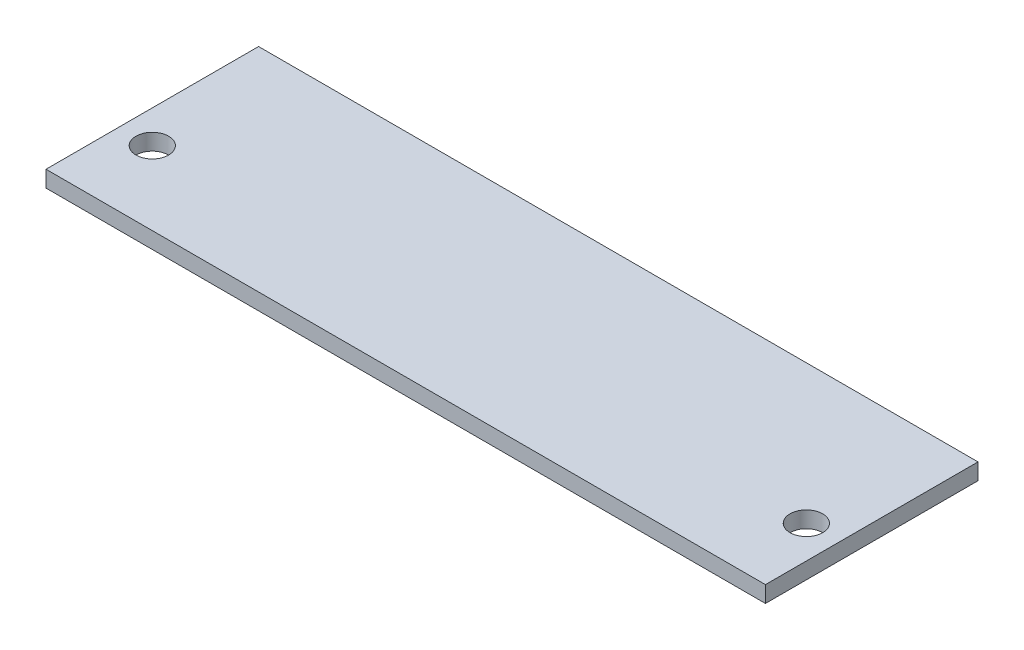
ISO-10303-21;
HEADER;
FILE_DESCRIPTION(('STEP AP214'),'2;1');
FILE_NAME('part.step','',(''),(''),'','','');
FILE_SCHEMA(('AUTOMOTIVE_DESIGN { 1 0 10303 214 1 1 1 1 }'));
ENDSEC;
DATA;
#1=APPLICATION_CONTEXT('core data for automotive mechanical design processes');
#2=APPLICATION_PROTOCOL_DEFINITION('international standard','automotive_design',2000,#1);
#3=PRODUCT_CONTEXT('',#1,'mechanical');
#4=PRODUCT('Part','Part','',(#3));
#5=PRODUCT_RELATED_PRODUCT_CATEGORY('part','',(#4));
#6=PRODUCT_DEFINITION_FORMATION('','',#4);
#7=PRODUCT_DEFINITION_CONTEXT('part definition',#1,'design');
#8=PRODUCT_DEFINITION('design','',#6,#7);
#9=PRODUCT_DEFINITION_SHAPE('','',#8);
#10=(LENGTH_UNIT() NAMED_UNIT(*) SI_UNIT(.MILLI.,.METRE.));
#11=(NAMED_UNIT(*) PLANE_ANGLE_UNIT() SI_UNIT($,.RADIAN.));
#12=(NAMED_UNIT(*) SI_UNIT($,.STERADIAN.) SOLID_ANGLE_UNIT());
#13=UNCERTAINTY_MEASURE_WITH_UNIT(LENGTH_MEASURE(1.E-05),#10,'distance_accuracy_value','');
#14=(GEOMETRIC_REPRESENTATION_CONTEXT(3) GLOBAL_UNCERTAINTY_ASSIGNED_CONTEXT((#13)) GLOBAL_UNIT_ASSIGNED_CONTEXT((#10,
#11,#12)) REPRESENTATION_CONTEXT('',''));
#15=CARTESIAN_POINT('',(0.,0.,0.));
#16=DIRECTION('',(0.,0.,1.));
#17=DIRECTION('',(1.,0.,0.));
#18=AXIS2_PLACEMENT_3D('',#15,#16,#17);
#19=CARTESIAN_POINT('',(0.,6.35,0.));
#20=DIRECTION('',(0.,1.,0.));
#21=DIRECTION('',(0.,0.,1.));
#22=AXIS2_PLACEMENT_3D('',#19,#20,#21);
#23=PLANE('',#22);
#24=CARTESIAN_POINT('',(12.7,6.35,53.97321438));
#25=DIRECTION('',(0.,1.,0.));
#26=DIRECTION('',(0.,0.,1.));
#27=AXIS2_PLACEMENT_3D('',#24,#25,#26);
#28=CIRCLE('',#27,6.35);
#29=CARTESIAN_POINT('',(12.7,6.35,60.32321438));
#30=VERTEX_POINT('',#29);
#31=EDGE_CURVE('E102',#30,#30,#28,.T.);
#32=ORIENTED_EDGE('',*,*,#31,.F.);
#33=EDGE_LOOP('',(#32));
#34=FACE_BOUND('',#33,.T.);
#35=DIRECTION('',(0.,0.,1.));
#36=VECTOR('',#35,1.);
#37=CARTESIAN_POINT('',(0.,6.35,0.));
#38=LINE('',#37,#36);
#39=CARTESIAN_POINT('',(0.,6.35,0.));
#40=VERTEX_POINT('',#39);
#41=CARTESIAN_POINT('',(0.,6.35,82.55));
#42=VERTEX_POINT('',#41);
#43=EDGE_CURVE('E87',#40,#42,#38,.T.);
#44=ORIENTED_EDGE('',*,*,#43,.T.);
#45=DIRECTION('',(1.,0.,0.));
#46=VECTOR('',#45,1.);
#47=CARTESIAN_POINT('',(0.,6.35,82.55));
#48=LINE('',#47,#46);
#49=CARTESIAN_POINT('',(279.4,6.35,82.55));
#50=VERTEX_POINT('',#49);
#51=EDGE_CURVE('E82',#42,#50,#48,.T.);
#52=ORIENTED_EDGE('',*,*,#51,.T.);
#53=DIRECTION('',(0.,0.,-1.));
#54=VECTOR('',#53,1.);
#55=CARTESIAN_POINT('',(279.4,6.35,0.));
#56=LINE('',#55,#54);
#57=CARTESIAN_POINT('',(279.4,6.35,0.));
#58=VERTEX_POINT('',#57);
#59=EDGE_CURVE('E85',#50,#58,#56,.T.);
#60=ORIENTED_EDGE('',*,*,#59,.T.);
#61=DIRECTION('',(-1.,0.,0.));
#62=VECTOR('',#61,1.);
#63=CARTESIAN_POINT('',(0.,6.35,0.));
#64=LINE('',#63,#62);
#65=EDGE_CURVE('E52',#58,#40,#64,.T.);
#66=ORIENTED_EDGE('',*,*,#65,.T.);
#67=EDGE_LOOP('',(#44,#52,#60,#66));
#68=FACE_BOUND('',#67,.T.);
#69=CARTESIAN_POINT('',(266.7,6.35,53.97321438));
#70=DIRECTION('',(0.,1.,0.));
#71=DIRECTION('',(0.,0.,1.));
#72=AXIS2_PLACEMENT_3D('',#69,#70,#71);
#73=CIRCLE('',#72,6.35);
#74=CARTESIAN_POINT('',(266.7,6.35,60.32321438));
#75=VERTEX_POINT('',#74);
#76=EDGE_CURVE('E117',#75,#75,#73,.T.);
#77=ORIENTED_EDGE('',*,*,#76,.F.);
#78=EDGE_LOOP('',(#77));
#79=FACE_BOUND('',#78,.T.);
#80=ADVANCED_FACE('F35',(#34,#68,#79),#23,.T.);
#81=CARTESIAN_POINT('',(0.,0.,0.));
#82=DIRECTION('',(0.,1.,0.));
#83=DIRECTION('',(0.,0.,1.));
#84=AXIS2_PLACEMENT_3D('',#81,#82,#83);
#85=PLANE('',#84);
#86=DIRECTION('',(0.,0.,1.));
#87=VECTOR('',#86,1.);
#88=CARTESIAN_POINT('',(0.,0.,0.));
#89=LINE('',#88,#87);
#90=CARTESIAN_POINT('',(0.,0.,0.));
#91=VERTEX_POINT('',#90);
#92=CARTESIAN_POINT('',(0.,0.,82.55));
#93=VERTEX_POINT('',#92);
#94=EDGE_CURVE('E99',#91,#93,#89,.T.);
#95=ORIENTED_EDGE('',*,*,#94,.F.);
#96=DIRECTION('',(-1.,0.,0.));
#97=VECTOR('',#96,1.);
#98=CARTESIAN_POINT('',(0.,0.,0.));
#99=LINE('',#98,#97);
#100=CARTESIAN_POINT('',(279.4,0.,0.));
#101=VERTEX_POINT('',#100);
#102=EDGE_CURVE('E75',#101,#91,#99,.T.);
#103=ORIENTED_EDGE('',*,*,#102,.F.);
#104=DIRECTION('',(0.,0.,-1.));
#105=VECTOR('',#104,1.);
#106=CARTESIAN_POINT('',(279.4,0.,0.));
#107=LINE('',#106,#105);
#108=CARTESIAN_POINT('',(279.4,0.,82.55));
#109=VERTEX_POINT('',#108);
#110=EDGE_CURVE('E69',#109,#101,#107,.T.);
#111=ORIENTED_EDGE('',*,*,#110,.F.);
#112=DIRECTION('',(1.,0.,0.));
#113=VECTOR('',#112,1.);
#114=CARTESIAN_POINT('',(0.,0.,82.55));
#115=LINE('',#114,#113);
#116=EDGE_CURVE('E91',#93,#109,#115,.T.);
#117=ORIENTED_EDGE('',*,*,#116,.F.);
#118=EDGE_LOOP('',(#95,#103,#111,#117));
#119=FACE_BOUND('',#118,.T.);
#120=CARTESIAN_POINT('',(12.7,0.,53.97321438));
#121=DIRECTION('',(0.,1.,0.));
#122=DIRECTION('',(0.,0.,1.));
#123=AXIS2_PLACEMENT_3D('',#120,#121,#122);
#124=CIRCLE('',#123,6.35);
#125=CARTESIAN_POINT('',(12.7,0.,60.32321438));
#126=VERTEX_POINT('',#125);
#127=EDGE_CURVE('E114',#126,#126,#124,.T.);
#128=ORIENTED_EDGE('',*,*,#127,.T.);
#129=EDGE_LOOP('',(#128));
#130=FACE_BOUND('',#129,.T.);
#131=CARTESIAN_POINT('',(266.7,0.,53.97321438));
#132=DIRECTION('',(0.,1.,0.));
#133=DIRECTION('',(0.,0.,1.));
#134=AXIS2_PLACEMENT_3D('',#131,#132,#133);
#135=CIRCLE('',#134,6.35);
#136=CARTESIAN_POINT('',(266.7,0.,60.32321438));
#137=VERTEX_POINT('',#136);
#138=EDGE_CURVE('E120',#137,#137,#135,.T.);
#139=ORIENTED_EDGE('',*,*,#138,.T.);
#140=EDGE_LOOP('',(#139));
#141=FACE_BOUND('',#140,.T.);
#142=ADVANCED_FACE('F110',(#119,#130,#141),#85,.F.);
#143=CARTESIAN_POINT('',(0.,6.35,0.));
#144=DIRECTION('',(1.,0.,0.));
#145=DIRECTION('',(0.,0.,-1.));
#146=AXIS2_PLACEMENT_3D('',#143,#144,#145);
#147=PLANE('',#146);
#148=ORIENTED_EDGE('',*,*,#94,.T.);
#149=DIRECTION('',(0.,-1.,0.));
#150=VECTOR('',#149,1.);
#151=CARTESIAN_POINT('',(0.,6.35,82.55));
#152=LINE('',#151,#150);
#153=EDGE_CURVE('E11',#42,#93,#152,.T.);
#154=ORIENTED_EDGE('',*,*,#153,.F.);
#155=ORIENTED_EDGE('',*,*,#43,.F.);
#156=DIRECTION('',(0.,-1.,0.));
#157=VECTOR('',#156,1.);
#158=CARTESIAN_POINT('',(0.,6.35,0.));
#159=LINE('',#158,#157);
#160=EDGE_CURVE('E95',#40,#91,#159,.T.);
#161=ORIENTED_EDGE('',*,*,#160,.T.);
#162=EDGE_LOOP('',(#148,#154,#155,#161));
#163=FACE_BOUND('',#162,.T.);
#164=ADVANCED_FACE('F37',(#163),#147,.F.);
#165=CARTESIAN_POINT('',(0.,6.35,82.55));
#166=DIRECTION('',(0.,0.,-1.));
#167=DIRECTION('',(-1.,0.,0.));
#168=AXIS2_PLACEMENT_3D('',#165,#166,#167);
#169=PLANE('',#168);
#170=ORIENTED_EDGE('',*,*,#116,.T.);
#171=DIRECTION('',(0.,-1.,0.));
#172=VECTOR('',#171,1.);
#173=CARTESIAN_POINT('',(279.4,6.35,82.55));
#174=LINE('',#173,#172);
#175=EDGE_CURVE('E44',#50,#109,#174,.T.);
#176=ORIENTED_EDGE('',*,*,#175,.F.);
#177=ORIENTED_EDGE('',*,*,#51,.F.);
#178=ORIENTED_EDGE('',*,*,#153,.T.);
#179=EDGE_LOOP('',(#170,#176,#177,#178));
#180=FACE_BOUND('',#179,.T.);
#181=ADVANCED_FACE('F90',(#180),#169,.F.);
#182=CARTESIAN_POINT('',(279.4,6.35,0.));
#183=DIRECTION('',(-1.,0.,0.));
#184=DIRECTION('',(0.,0.,1.));
#185=AXIS2_PLACEMENT_3D('',#182,#183,#184);
#186=PLANE('',#185);
#187=ORIENTED_EDGE('',*,*,#110,.T.);
#188=DIRECTION('',(0.,-1.,0.));
#189=VECTOR('',#188,1.);
#190=CARTESIAN_POINT('',(279.4,6.35,0.));
#191=LINE('',#190,#189);
#192=EDGE_CURVE('E92',#58,#101,#191,.T.);
#193=ORIENTED_EDGE('',*,*,#192,.F.);
#194=ORIENTED_EDGE('',*,*,#59,.F.);
#195=ORIENTED_EDGE('',*,*,#175,.T.);
#196=EDGE_LOOP('',(#187,#193,#194,#195));
#197=FACE_BOUND('',#196,.T.);
#198=ADVANCED_FACE('F93',(#197),#186,.F.);
#199=CARTESIAN_POINT('',(0.,6.35,0.));
#200=DIRECTION('',(0.,0.,1.));
#201=DIRECTION('',(1.,0.,0.));
#202=AXIS2_PLACEMENT_3D('',#199,#200,#201);
#203=PLANE('',#202);
#204=ORIENTED_EDGE('',*,*,#102,.T.);
#205=ORIENTED_EDGE('',*,*,#160,.F.);
#206=ORIENTED_EDGE('',*,*,#65,.F.);
#207=ORIENTED_EDGE('',*,*,#192,.T.);
#208=EDGE_LOOP('',(#204,#205,#206,#207));
#209=FACE_BOUND('',#208,.T.);
#210=ADVANCED_FACE('F107',(#209),#203,.F.);
#211=CARTESIAN_POINT('',(12.7,6.35,53.97321438));
#212=DIRECTION('',(0.,-1.,0.));
#213=DIRECTION('',(0.,0.,-1.));
#214=AXIS2_PLACEMENT_3D('',#211,#212,#213);
#215=CYLINDRICAL_SURFACE('',#214,6.35);
#216=ORIENTED_EDGE('',*,*,#31,.T.);
#217=EDGE_LOOP('',(#216));
#218=FACE_BOUND('',#217,.T.);
#219=ORIENTED_EDGE('',*,*,#127,.F.);
#220=EDGE_LOOP('',(#219));
#221=FACE_BOUND('',#220,.T.);
#222=ADVANCED_FACE('F137',(#218,#221),#215,.F.);
#223=CARTESIAN_POINT('',(266.7,6.35,53.97321438));
#224=DIRECTION('',(0.,-1.,0.));
#225=DIRECTION('',(0.,0.,-1.));
#226=AXIS2_PLACEMENT_3D('',#223,#224,#225);
#227=CYLINDRICAL_SURFACE('',#226,6.35);
#228=ORIENTED_EDGE('',*,*,#76,.T.);
#229=EDGE_LOOP('',(#228));
#230=FACE_BOUND('',#229,.T.);
#231=ORIENTED_EDGE('',*,*,#138,.F.);
#232=EDGE_LOOP('',(#231));
#233=FACE_BOUND('',#232,.T.);
#234=ADVANCED_FACE('F126',(#230,#233),#227,.F.);
#235=CLOSED_SHELL('',(#80,#142,#164,#181,#198,#210,#222,#234));
#236=MANIFOLD_SOLID_BREP('B2',#235);
#237=ADVANCED_BREP_SHAPE_REPRESENTATION('',(#18,#236),#14);
#238=SHAPE_DEFINITION_REPRESENTATION(#9,#237);
ENDSEC;
END-ISO-10303-21;
